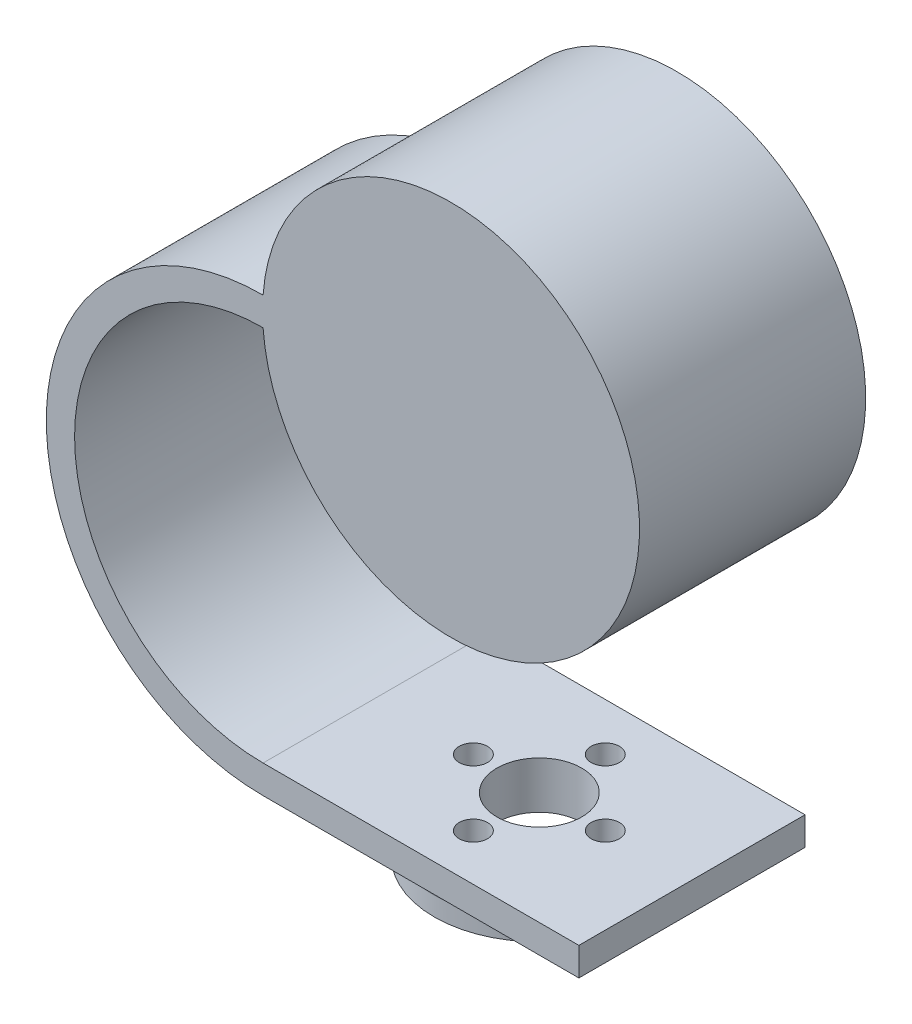
ISO-10303-21;
HEADER;
FILE_DESCRIPTION(('STEP AP214'),'2;1');
FILE_NAME('part.step','',(''),(''),'','','');
FILE_SCHEMA(('AUTOMOTIVE_DESIGN { 1 0 10303 214 1 1 1 1 }'));
ENDSEC;
DATA;
#1=APPLICATION_CONTEXT('core data for automotive mechanical design processes');
#2=APPLICATION_PROTOCOL_DEFINITION('international standard','automotive_design',2000,#1);
#3=PRODUCT_CONTEXT('',#1,'mechanical');
#4=PRODUCT('Part','Part','',(#3));
#5=PRODUCT_RELATED_PRODUCT_CATEGORY('part','',(#4));
#6=PRODUCT_DEFINITION_FORMATION('','',#4);
#7=PRODUCT_DEFINITION_CONTEXT('part definition',#1,'design');
#8=PRODUCT_DEFINITION('design','',#6,#7);
#9=PRODUCT_DEFINITION_SHAPE('','',#8);
#10=(LENGTH_UNIT() NAMED_UNIT(*) SI_UNIT(.MILLI.,.METRE.));
#11=(NAMED_UNIT(*) PLANE_ANGLE_UNIT() SI_UNIT($,.RADIAN.));
#12=(NAMED_UNIT(*) SI_UNIT($,.STERADIAN.) SOLID_ANGLE_UNIT());
#13=UNCERTAINTY_MEASURE_WITH_UNIT(LENGTH_MEASURE(1.E-05),#10,'distance_accuracy_value','');
#14=(GEOMETRIC_REPRESENTATION_CONTEXT(3) GLOBAL_UNCERTAINTY_ASSIGNED_CONTEXT((#13)) GLOBAL_UNIT_ASSIGNED_CONTEXT((#10,
#11,#12)) REPRESENTATION_CONTEXT('',''));
#15=CARTESIAN_POINT('',(0.,0.,0.));
#16=DIRECTION('',(0.,0.,1.));
#17=DIRECTION('',(1.,0.,0.));
#18=AXIS2_PLACEMENT_3D('',#15,#16,#17);
#19=CARTESIAN_POINT('',(30.2631221479555,-52.276236141899,24.));
#20=DIRECTION('',(0.,1.,0.));
#21=DIRECTION('',(0.,0.,1.));
#22=AXIS2_PLACEMENT_3D('',#19,#20,#21);
#23=PLANE('',#22);
#24=CARTESIAN_POINT('',(14.1198779241432,-52.276236141899,12.0544614883675));
#25=DIRECTION('',(0.,1.,0.));
#26=DIRECTION('',(0.,0.,1.));
#27=AXIS2_PLACEMENT_3D('',#24,#25,#26);
#28=CIRCLE('',#27,10.);
#29=CARTESIAN_POINT('',(15.2814853328757,-52.276236141899,21.9867657642129));
#30=VERTEX_POINT('',#29);
#31=CARTESIAN_POINT('',(12.8289573034485,-52.276236141899,2.13813535662565));
#32=VERTEX_POINT('',#31);
#33=EDGE_CURVE('E148',#30,#32,#28,.F.);
#34=ORIENTED_EDGE('',*,*,#33,.F.);
#35=CARTESIAN_POINT('',(13.9905647121855,-52.276236141899,12.0704396324706));
#36=DIRECTION('',(0.,-1.,0.));
#37=DIRECTION('',(0.,0.,-1.));
#38=AXIS2_PLACEMENT_3D('',#35,#36,#37);
#39=CIRCLE('',#38,9.99999999999998);
#40=EDGE_CURVE('E202',#30,#32,#39,.T.);
#41=ORIENTED_EDGE('',*,*,#40,.T.);
#42=EDGE_LOOP('',(#34,#41));
#43=FACE_BOUND('',#42,.T.);
#44=ADVANCED_FACE('F47',(#43),#23,.F.);
#45=CARTESIAN_POINT('',(14.1198779241432,-54.276236141899,12.0544614883675));
#46=DIRECTION('',(0.,-1.,0.));
#47=DIRECTION('',(0.,0.,-1.));
#48=AXIS2_PLACEMENT_3D('',#45,#46,#47);
#49=PLANE('',#48);
#50=CARTESIAN_POINT('',(14.1198779241432,-54.276236141899,12.0544614883675));
#51=DIRECTION('',(0.,-1.,0.));
#52=DIRECTION('',(0.,0.,-1.));
#53=AXIS2_PLACEMENT_3D('',#50,#51,#52);
#54=CIRCLE('',#53,4.5);
#55=CARTESIAN_POINT('',(14.1198779241432,-54.276236141899,7.55446148836747));
#56=VERTEX_POINT('',#55);
#57=EDGE_CURVE('E279',#56,#56,#54,.T.);
#58=ORIENTED_EDGE('',*,*,#57,.F.);
#59=EDGE_LOOP('',(#58));
#60=FACE_BOUND('',#59,.T.);
#61=CARTESIAN_POINT('',(21.1198779241432,-54.276236141899,12.0544614883675));
#62=DIRECTION('',(0.,-1.,0.));
#63=DIRECTION('',(0.,0.,-1.));
#64=AXIS2_PLACEMENT_3D('',#61,#62,#63);
#65=CIRCLE('',#64,1.5);
#66=CARTESIAN_POINT('',(21.1198779241432,-54.276236141899,10.5544614883675));
#67=VERTEX_POINT('',#66);
#68=EDGE_CURVE('E303',#67,#67,#65,.T.);
#69=ORIENTED_EDGE('',*,*,#68,.F.);
#70=EDGE_LOOP('',(#69));
#71=FACE_BOUND('',#70,.T.);
#72=CARTESIAN_POINT('',(14.1198779241432,-54.276236141899,5.05446148836747));
#73=DIRECTION('',(0.,-1.,0.));
#74=DIRECTION('',(0.,0.,-1.));
#75=AXIS2_PLACEMENT_3D('',#72,#73,#74);
#76=CIRCLE('',#75,1.5);
#77=CARTESIAN_POINT('',(14.1198779241432,-54.276236141899,3.55446148836747));
#78=VERTEX_POINT('',#77);
#79=EDGE_CURVE('E280',#78,#78,#76,.T.);
#80=ORIENTED_EDGE('',*,*,#79,.F.);
#81=EDGE_LOOP('',(#80));
#82=FACE_BOUND('',#81,.T.);
#83=CARTESIAN_POINT('',(7.11987792414318,-54.276236141899,12.0544614883675));
#84=DIRECTION('',(0.,-1.,0.));
#85=DIRECTION('',(0.,0.,-1.));
#86=AXIS2_PLACEMENT_3D('',#83,#84,#85);
#87=CIRCLE('',#86,1.5);
#88=CARTESIAN_POINT('',(7.11987792414318,-54.276236141899,10.5544614883675));
#89=VERTEX_POINT('',#88);
#90=EDGE_CURVE('E289',#89,#89,#87,.T.);
#91=ORIENTED_EDGE('',*,*,#90,.F.);
#92=EDGE_LOOP('',(#91));
#93=FACE_BOUND('',#92,.T.);
#94=CARTESIAN_POINT('',(14.1198779241432,-54.276236141899,19.0544614883675));
#95=DIRECTION('',(0.,-1.,0.));
#96=DIRECTION('',(0.,0.,-1.));
#97=AXIS2_PLACEMENT_3D('',#94,#95,#96);
#98=CIRCLE('',#97,1.5);
#99=CARTESIAN_POINT('',(14.1198779241432,-54.276236141899,17.5544614883675));
#100=VERTEX_POINT('',#99);
#101=EDGE_CURVE('E275',#100,#100,#98,.T.);
#102=ORIENTED_EDGE('',*,*,#101,.F.);
#103=EDGE_LOOP('',(#102));
#104=FACE_BOUND('',#103,.T.);
#105=CARTESIAN_POINT('',(13.9905647121855,-54.276236141899,12.0704396324706));
#106=DIRECTION('',(0.,-1.,0.));
#107=DIRECTION('',(0.,0.,-1.));
#108=AXIS2_PLACEMENT_3D('',#105,#106,#107);
#109=CIRCLE('',#108,9.99999999999998);
#110=CARTESIAN_POINT('',(15.2814853328757,-54.276236141899,21.9867657642129));
#111=VERTEX_POINT('',#110);
#112=CARTESIAN_POINT('',(12.8289573034485,-54.276236141899,2.13813535662566));
#113=VERTEX_POINT('',#112);
#114=EDGE_CURVE('E136',#111,#113,#109,.F.);
#115=ORIENTED_EDGE('',*,*,#114,.F.);
#116=CARTESIAN_POINT('',(14.1198779241432,-54.276236141899,12.0544614883675));
#117=DIRECTION('',(0.,-1.,0.));
#118=DIRECTION('',(0.,0.,-1.));
#119=AXIS2_PLACEMENT_3D('',#116,#117,#118);
#120=CIRCLE('',#119,10.);
#121=EDGE_CURVE('E132',#111,#113,#120,.T.);
#122=ORIENTED_EDGE('',*,*,#121,.T.);
#123=EDGE_LOOP('',(#115,#122));
#124=FACE_BOUND('',#123,.T.);
#125=ADVANCED_FACE('F134',(#60,#71,#82,#93,#104,#124),#49,.T.);
#126=DIRECTION('',(1.,0.,0.));
#127=VECTOR('',#126,1.);
#128=CARTESIAN_POINT('',(30.2631221479555,-52.276236141899,24.));
#129=LINE('',#128,#127);
#130=CARTESIAN_POINT('',(15.2888672337385,-52.276236141899,24.));
#131=VERTEX_POINT('',#130);
#132=CARTESIAN_POINT('',(30.2631221479555,-52.276236141899,24.));
#133=VERTEX_POINT('',#132);
#134=EDGE_CURVE('E314',#131,#133,#129,.T.);
#135=ORIENTED_EDGE('',*,*,#134,.F.);
#136=CARTESIAN_POINT('',(13.9905647121855,-52.276236141899,12.0704396324706));
#137=DIRECTION('',(0.,1.,0.));
#138=DIRECTION('',(0.,0.,1.));
#139=AXIS2_PLACEMENT_3D('',#136,#137,#138);
#140=CIRCLE('',#139,12.);
#141=CARTESIAN_POINT('',(12.6922621906326,-52.276236141899,24.));
#142=VERTEX_POINT('',#141);
#143=EDGE_CURVE('E11',#131,#142,#140,.T.);
#144=ORIENTED_EDGE('',*,*,#143,.T.);
#145=CARTESIAN_POINT('',(-3.24733384677033,-52.276236141899,24.));
#146=VERTEX_POINT('',#145);
#147=EDGE_CURVE('E310',#146,#142,#129,.T.);
#148=ORIENTED_EDGE('',*,*,#147,.F.);
#149=DIRECTION('',(0.,0.,-1.));
#150=VECTOR('',#149,1.);
#151=CARTESIAN_POINT('',(-3.24733384677033,-52.276236141899,24.));
#152=LINE('',#151,#150);
#153=CARTESIAN_POINT('',(-3.24733384677033,-52.276236141899,0.));
#154=VERTEX_POINT('',#153);
#155=EDGE_CURVE('E329',#146,#154,#152,.T.);
#156=ORIENTED_EDGE('',*,*,#155,.T.);
#157=DIRECTION('',(1.,0.,0.));
#158=VECTOR('',#157,1.);
#159=CARTESIAN_POINT('',(30.2631221479555,-52.276236141899,0.));
#160=LINE('',#159,#158);
#161=CARTESIAN_POINT('',(30.2631221479555,-52.276236141899,0.));
#162=VERTEX_POINT('',#161);
#163=EDGE_CURVE('E140',#154,#162,#160,.T.);
#164=ORIENTED_EDGE('',*,*,#163,.T.);
#165=DIRECTION('',(0.,0.,-1.));
#166=VECTOR('',#165,1.);
#167=CARTESIAN_POINT('',(30.2631221479555,-52.276236141899,24.));
#168=LINE('',#167,#166);
#169=EDGE_CURVE('E367',#133,#162,#168,.T.);
#170=ORIENTED_EDGE('',*,*,#169,.F.);
#171=EDGE_LOOP('',(#135,#144,#148,#156,#164,#170));
#172=FACE_BOUND('',#171,.T.);
#173=ADVANCED_FACE('F192',(#172),#23,.F.);
#174=CARTESIAN_POINT('',(30.2631221479555,-52.276236141899,24.));
#175=DIRECTION('',(-1.,0.,0.));
#176=DIRECTION('',(0.,0.,1.));
#177=AXIS2_PLACEMENT_3D('',#174,#175,#176);
#178=PLANE('',#177);
#179=DIRECTION('',(0.,1.,0.));
#180=VECTOR('',#179,1.);
#181=CARTESIAN_POINT('',(30.2631221479555,-52.276236141899,0.));
#182=LINE('',#181,#180);
#183=CARTESIAN_POINT('',(30.2631221479555,-49.276236141899,0.));
#184=VERTEX_POINT('',#183);
#185=EDGE_CURVE('E333',#162,#184,#182,.T.);
#186=ORIENTED_EDGE('',*,*,#185,.T.);
#187=DIRECTION('',(0.,0.,-1.));
#188=VECTOR('',#187,1.);
#189=CARTESIAN_POINT('',(30.2631221479555,-49.276236141899,24.));
#190=LINE('',#189,#188);
#191=CARTESIAN_POINT('',(30.2631221479555,-49.276236141899,24.));
#192=VERTEX_POINT('',#191);
#193=EDGE_CURVE('E363',#192,#184,#190,.T.);
#194=ORIENTED_EDGE('',*,*,#193,.F.);
#195=DIRECTION('',(0.,1.,0.));
#196=VECTOR('',#195,1.);
#197=CARTESIAN_POINT('',(30.2631221479555,-52.276236141899,24.));
#198=LINE('',#197,#196);
#199=EDGE_CURVE('E313',#133,#192,#198,.T.);
#200=ORIENTED_EDGE('',*,*,#199,.F.);
#201=ORIENTED_EDGE('',*,*,#169,.T.);
#202=EDGE_LOOP('',(#186,#194,#200,#201));
#203=FACE_BOUND('',#202,.T.);
#204=ADVANCED_FACE('F378',(#203),#178,.F.);
#205=CARTESIAN_POINT('',(30.2631221479555,-49.276236141899,24.));
#206=DIRECTION('',(0.,-1.,0.));
#207=DIRECTION('',(1.,0.,0.));
#208=AXIS2_PLACEMENT_3D('',#205,#206,#207);
#209=PLANE('',#208);
#210=CARTESIAN_POINT('',(14.1198779241432,-49.276236141899,19.0544614883675));
#211=DIRECTION('',(0.,-1.,0.));
#212=DIRECTION('',(0.,0.,-1.));
#213=AXIS2_PLACEMENT_3D('',#210,#211,#212);
#214=CIRCLE('',#213,1.5);
#215=CARTESIAN_POINT('',(14.1198779241432,-49.276236141899,17.5544614883675));
#216=VERTEX_POINT('',#215);
#217=EDGE_CURVE('E141',#216,#216,#214,.T.);
#218=ORIENTED_EDGE('',*,*,#217,.T.);
#219=EDGE_LOOP('',(#218));
#220=FACE_BOUND('',#219,.T.);
#221=CARTESIAN_POINT('',(7.11987792414318,-49.276236141899,12.0544614883675));
#222=DIRECTION('',(0.,-1.,0.));
#223=DIRECTION('',(0.,0.,-1.));
#224=AXIS2_PLACEMENT_3D('',#221,#222,#223);
#225=CIRCLE('',#224,1.5);
#226=CARTESIAN_POINT('',(7.11987792414318,-49.276236141899,10.5544614883675));
#227=VERTEX_POINT('',#226);
#228=EDGE_CURVE('E271',#227,#227,#225,.T.);
#229=ORIENTED_EDGE('',*,*,#228,.T.);
#230=EDGE_LOOP('',(#229));
#231=FACE_BOUND('',#230,.T.);
#232=CARTESIAN_POINT('',(14.1198779241432,-49.276236141899,5.05446148836747));
#233=DIRECTION('',(0.,-1.,0.));
#234=DIRECTION('',(0.,0.,-1.));
#235=AXIS2_PLACEMENT_3D('',#232,#233,#234);
#236=CIRCLE('',#235,1.5);
#237=CARTESIAN_POINT('',(14.1198779241432,-49.276236141899,3.55446148836747));
#238=VERTEX_POINT('',#237);
#239=EDGE_CURVE('E285',#238,#238,#236,.T.);
#240=ORIENTED_EDGE('',*,*,#239,.T.);
#241=EDGE_LOOP('',(#240));
#242=FACE_BOUND('',#241,.T.);
#243=CARTESIAN_POINT('',(21.1198779241432,-49.276236141899,12.0544614883675));
#244=DIRECTION('',(0.,-1.,0.));
#245=DIRECTION('',(0.,0.,-1.));
#246=AXIS2_PLACEMENT_3D('',#243,#244,#245);
#247=CIRCLE('',#246,1.5);
#248=CARTESIAN_POINT('',(21.1198779241432,-49.276236141899,10.5544614883675));
#249=VERTEX_POINT('',#248);
#250=EDGE_CURVE('E284',#249,#249,#247,.T.);
#251=ORIENTED_EDGE('',*,*,#250,.T.);
#252=EDGE_LOOP('',(#251));
#253=FACE_BOUND('',#252,.T.);
#254=CARTESIAN_POINT('',(14.1198779241432,-49.276236141899,12.0544614883675));
#255=DIRECTION('',(0.,-1.,0.));
#256=DIRECTION('',(0.,0.,-1.));
#257=AXIS2_PLACEMENT_3D('',#254,#255,#256);
#258=CIRCLE('',#257,4.5);
#259=CARTESIAN_POINT('',(14.1198779241432,-49.276236141899,7.55446148836747));
#260=VERTEX_POINT('',#259);
#261=EDGE_CURVE('E299',#260,#260,#258,.T.);
#262=ORIENTED_EDGE('',*,*,#261,.T.);
#263=EDGE_LOOP('',(#262));
#264=FACE_BOUND('',#263,.T.);
#265=DIRECTION('',(-1.,0.,0.));
#266=VECTOR('',#265,1.);
#267=CARTESIAN_POINT('',(30.2631221479555,-49.276236141899,0.));
#268=LINE('',#267,#266);
#269=CARTESIAN_POINT('',(-3.24733384677034,-49.276236141899,0.));
#270=VERTEX_POINT('',#269);
#271=EDGE_CURVE('E336',#184,#270,#268,.T.);
#272=ORIENTED_EDGE('',*,*,#271,.T.);
#273=DIRECTION('',(0.,0.,-1.));
#274=VECTOR('',#273,1.);
#275=CARTESIAN_POINT('',(-3.24733384677034,-49.276236141899,24.));
#276=LINE('',#275,#274);
#277=CARTESIAN_POINT('',(-3.24733384677034,-49.276236141899,24.));
#278=VERTEX_POINT('',#277);
#279=EDGE_CURVE('E359',#278,#270,#276,.T.);
#280=ORIENTED_EDGE('',*,*,#279,.F.);
#281=DIRECTION('',(-1.,0.,0.));
#282=VECTOR('',#281,1.);
#283=CARTESIAN_POINT('',(30.2631221479555,-49.276236141899,24.));
#284=LINE('',#283,#282);
#285=EDGE_CURVE('E317',#192,#278,#284,.T.);
#286=ORIENTED_EDGE('',*,*,#285,.F.);
#287=ORIENTED_EDGE('',*,*,#193,.T.);
#288=EDGE_LOOP('',(#272,#280,#286,#287));
#289=FACE_BOUND('',#288,.T.);
#290=ADVANCED_FACE('F389',(#220,#231,#242,#253,#264,#289),#209,.F.);
#291=CARTESIAN_POINT('',(-3.24733384677034,-29.276236141899,24.));
#292=DIRECTION('',(0.,0.,-1.));
#293=DIRECTION('',(-1.,0.,0.));
#294=AXIS2_PLACEMENT_3D('',#291,#292,#293);
#295=CYLINDRICAL_SURFACE('',#294,20.);
#296=CARTESIAN_POINT('',(-3.24733384677034,-29.276236141899,0.));
#297=DIRECTION('',(0.,0.,-1.));
#298=DIRECTION('',(-1.,0.,0.));
#299=AXIS2_PLACEMENT_3D('',#296,#297,#298);
#300=CIRCLE('',#299,20.);
#301=CARTESIAN_POINT('',(-3.24733384677034,-9.27623614189904,0.));
#302=VERTEX_POINT('',#301);
#303=EDGE_CURVE('E339',#270,#302,#300,.T.);
#304=ORIENTED_EDGE('',*,*,#303,.T.);
#305=DIRECTION('',(0.,0.,-1.));
#306=VECTOR('',#305,1.);
#307=CARTESIAN_POINT('',(-3.24733384677034,-9.27623614189904,24.));
#308=LINE('',#307,#306);
#309=CARTESIAN_POINT('',(-3.24733384677034,-9.27623614189904,24.));
#310=VERTEX_POINT('',#309);
#311=EDGE_CURVE('E355',#310,#302,#308,.T.);
#312=ORIENTED_EDGE('',*,*,#311,.F.);
#313=CARTESIAN_POINT('',(-3.24733384677034,-29.276236141899,24.));
#314=DIRECTION('',(0.,0.,-1.));
#315=DIRECTION('',(-1.,0.,0.));
#316=AXIS2_PLACEMENT_3D('',#313,#314,#315);
#317=CIRCLE('',#316,20.);
#318=EDGE_CURVE('E320',#278,#310,#317,.T.);
#319=ORIENTED_EDGE('',*,*,#318,.F.);
#320=ORIENTED_EDGE('',*,*,#279,.T.);
#321=EDGE_LOOP('',(#304,#312,#319,#320));
#322=FACE_BOUND('',#321,.T.);
#323=ADVANCED_FACE('F396',(#322),#295,.F.);
#324=CARTESIAN_POINT('',(16.6963368284088,-7.77623614189905,24.));
#325=DIRECTION('',(0.,0.,-1.));
#326=DIRECTION('',(-1.,0.,0.));
#327=AXIS2_PLACEMENT_3D('',#324,#325,#326);
#328=CYLINDRICAL_SURFACE('',#327,20.);
#329=CARTESIAN_POINT('',(16.6963368284088,-7.77623614189905,0.));
#330=DIRECTION('',(0.,0.,1.));
#331=DIRECTION('',(1.,0.,0.));
#332=AXIS2_PLACEMENT_3D('',#329,#330,#331);
#333=CIRCLE('',#332,20.);
#334=CARTESIAN_POINT('',(-3.24733384677034,-6.27623614189907,0.));
#335=VERTEX_POINT('',#334);
#336=EDGE_CURVE('E342',#302,#335,#333,.T.);
#337=ORIENTED_EDGE('',*,*,#336,.T.);
#338=DIRECTION('',(0.,0.,-1.));
#339=VECTOR('',#338,1.);
#340=CARTESIAN_POINT('',(-3.24733384677034,-6.27623614189907,24.));
#341=LINE('',#340,#339);
#342=CARTESIAN_POINT('',(-3.24733384677034,-6.27623614189907,24.));
#343=VERTEX_POINT('',#342);
#344=EDGE_CURVE('E351',#343,#335,#341,.T.);
#345=ORIENTED_EDGE('',*,*,#344,.F.);
#346=CARTESIAN_POINT('',(16.6963368284088,-7.77623614189905,24.));
#347=DIRECTION('',(0.,0.,1.));
#348=DIRECTION('',(1.,0.,0.));
#349=AXIS2_PLACEMENT_3D('',#346,#347,#348);
#350=CIRCLE('',#349,20.);
#351=EDGE_CURVE('E323',#310,#343,#350,.T.);
#352=ORIENTED_EDGE('',*,*,#351,.F.);
#353=ORIENTED_EDGE('',*,*,#311,.T.);
#354=EDGE_LOOP('',(#337,#345,#352,#353));
#355=FACE_BOUND('',#354,.T.);
#356=ADVANCED_FACE('F398',(#355),#328,.T.);
#357=CARTESIAN_POINT('',(-3.24733384677034,-29.276236141899,24.));
#358=DIRECTION('',(0.,0.,-1.));
#359=DIRECTION('',(-1.,0.,0.));
#360=AXIS2_PLACEMENT_3D('',#357,#358,#359);
#361=CYLINDRICAL_SURFACE('',#360,23.);
#362=CARTESIAN_POINT('',(-3.24733384677034,-29.276236141899,0.));
#363=DIRECTION('',(0.,0.,1.));
#364=DIRECTION('',(-1.,0.,0.));
#365=AXIS2_PLACEMENT_3D('',#362,#363,#364);
#366=CIRCLE('',#365,23.);
#367=EDGE_CURVE('E345',#335,#154,#366,.T.);
#368=ORIENTED_EDGE('',*,*,#367,.T.);
#369=ORIENTED_EDGE('',*,*,#155,.F.);
#370=CARTESIAN_POINT('',(-3.24733384677034,-29.276236141899,24.));
#371=DIRECTION('',(0.,0.,1.));
#372=DIRECTION('',(-1.,0.,0.));
#373=AXIS2_PLACEMENT_3D('',#370,#371,#372);
#374=CIRCLE('',#373,23.);
#375=EDGE_CURVE('E326',#343,#146,#374,.T.);
#376=ORIENTED_EDGE('',*,*,#375,.F.);
#377=ORIENTED_EDGE('',*,*,#344,.T.);
#378=EDGE_LOOP('',(#368,#369,#376,#377));
#379=FACE_BOUND('',#378,.T.);
#380=ADVANCED_FACE('F401',(#379),#361,.T.);
#381=CARTESIAN_POINT('',(-3.24733384677034,-29.276236141899,24.));
#382=DIRECTION('',(0.,0.,-1.));
#383=DIRECTION('',(-1.,0.,0.));
#384=AXIS2_PLACEMENT_3D('',#381,#382,#383);
#385=PLANE('',#384);
#386=ORIENTED_EDGE('',*,*,#147,.T.);
#387=EDGE_CURVE('E208',#142,#131,#129,.T.);
#388=ORIENTED_EDGE('',*,*,#387,.T.);
#389=ORIENTED_EDGE('',*,*,#134,.T.);
#390=ORIENTED_EDGE('',*,*,#199,.T.);
#391=ORIENTED_EDGE('',*,*,#285,.T.);
#392=ORIENTED_EDGE('',*,*,#318,.T.);
#393=ORIENTED_EDGE('',*,*,#351,.T.);
#394=ORIENTED_EDGE('',*,*,#375,.T.);
#395=EDGE_LOOP('',(#386,#388,#389,#390,#391,#392,#393,#394));
#396=FACE_BOUND('',#395,.T.);
#397=ADVANCED_FACE('F195',(#396),#385,.F.);
#398=CARTESIAN_POINT('',(-3.24733384677034,-29.276236141899,0.));
#399=DIRECTION('',(0.,0.,-1.));
#400=DIRECTION('',(-1.,0.,0.));
#401=AXIS2_PLACEMENT_3D('',#398,#399,#400);
#402=PLANE('',#401);
#403=CARTESIAN_POINT('',(17.2217108120383,-7.59831274438809,0.));
#404=DIRECTION('',(0.,0.,-1.));
#405=DIRECTION('',(-1.,0.,0.));
#406=AXIS2_PLACEMENT_3D('',#403,#404,#405);
#407=CIRCLE('',#406,11.);
#408=CARTESIAN_POINT('',(6.22171081203829,-7.59831274438809,0.));
#409=VERTEX_POINT('',#408);
#410=EDGE_CURVE('E158',#409,#409,#407,.F.);
#411=ORIENTED_EDGE('',*,*,#410,.T.);
#412=EDGE_LOOP('',(#411));
#413=FACE_BOUND('',#412,.T.);
#414=ORIENTED_EDGE('',*,*,#163,.F.);
#415=ORIENTED_EDGE('',*,*,#367,.F.);
#416=ORIENTED_EDGE('',*,*,#336,.F.);
#417=ORIENTED_EDGE('',*,*,#303,.F.);
#418=ORIENTED_EDGE('',*,*,#271,.F.);
#419=ORIENTED_EDGE('',*,*,#185,.F.);
#420=EDGE_LOOP('',(#414,#415,#416,#417,#418,#419));
#421=FACE_BOUND('',#420,.T.);
#422=ADVANCED_FACE('F384',(#413,#421),#402,.T.);
#423=CARTESIAN_POINT('',(14.1198779241432,-54.276236141899,12.0544614883675));
#424=DIRECTION('',(0.,1.,0.));
#425=DIRECTION('',(0.,0.,1.));
#426=AXIS2_PLACEMENT_3D('',#423,#424,#425);
#427=CYLINDRICAL_SURFACE('',#426,10.);
#428=ORIENTED_EDGE('',*,*,#121,.F.);
#429=DIRECTION('',(0.,1.,0.));
#430=VECTOR('',#429,1.);
#431=CARTESIAN_POINT('',(15.2814853328757,-53.776236141899,21.9867657642129));
#432=LINE('',#431,#430);
#433=EDGE_CURVE('E152',#111,#30,#432,.T.);
#434=ORIENTED_EDGE('',*,*,#433,.T.);
#435=ORIENTED_EDGE('',*,*,#33,.T.);
#436=DIRECTION('',(0.,1.,0.));
#437=VECTOR('',#436,1.);
#438=CARTESIAN_POINT('',(12.8289573034485,-53.776236141899,2.13813535662566));
#439=LINE('',#438,#437);
#440=EDGE_CURVE('E145',#32,#113,#439,.F.);
#441=ORIENTED_EDGE('',*,*,#440,.T.);
#442=EDGE_LOOP('',(#428,#434,#435,#441));
#443=FACE_BOUND('',#442,.T.);
#444=ADVANCED_FACE('F146',(#443),#427,.T.);
#445=CARTESIAN_POINT('',(14.1198779241432,-49.276236141899,12.0544614883675));
#446=DIRECTION('',(0.,-1.,0.));
#447=DIRECTION('',(0.,0.,-1.));
#448=AXIS2_PLACEMENT_3D('',#445,#446,#447);
#449=CYLINDRICAL_SURFACE('',#448,4.5);
#450=ORIENTED_EDGE('',*,*,#261,.F.);
#451=EDGE_LOOP('',(#450));
#452=FACE_BOUND('',#451,.T.);
#453=ORIENTED_EDGE('',*,*,#57,.T.);
#454=EDGE_LOOP('',(#453));
#455=FACE_BOUND('',#454,.T.);
#456=ADVANCED_FACE('F467',(#452,#455),#449,.F.);
#457=CARTESIAN_POINT('',(21.1198779241432,-49.276236141899,12.0544614883675));
#458=DIRECTION('',(0.,-1.,0.));
#459=DIRECTION('',(0.,0.,-1.));
#460=AXIS2_PLACEMENT_3D('',#457,#458,#459);
#461=CYLINDRICAL_SURFACE('',#460,1.5);
#462=ORIENTED_EDGE('',*,*,#250,.F.);
#463=EDGE_LOOP('',(#462));
#464=FACE_BOUND('',#463,.T.);
#465=ORIENTED_EDGE('',*,*,#68,.T.);
#466=EDGE_LOOP('',(#465));
#467=FACE_BOUND('',#466,.T.);
#468=ADVANCED_FACE('F476',(#464,#467),#461,.F.);
#469=CARTESIAN_POINT('',(14.1198779241432,-49.276236141899,5.05446148836747));
#470=DIRECTION('',(0.,-1.,0.));
#471=DIRECTION('',(0.,0.,-1.));
#472=AXIS2_PLACEMENT_3D('',#469,#470,#471);
#473=CYLINDRICAL_SURFACE('',#472,1.5);
#474=ORIENTED_EDGE('',*,*,#239,.F.);
#475=EDGE_LOOP('',(#474));
#476=FACE_BOUND('',#475,.T.);
#477=ORIENTED_EDGE('',*,*,#79,.T.);
#478=EDGE_LOOP('',(#477));
#479=FACE_BOUND('',#478,.T.);
#480=ADVANCED_FACE('F486',(#476,#479),#473,.F.);
#481=CARTESIAN_POINT('',(7.11987792414318,-49.276236141899,12.0544614883675));
#482=DIRECTION('',(0.,-1.,0.));
#483=DIRECTION('',(0.,0.,-1.));
#484=AXIS2_PLACEMENT_3D('',#481,#482,#483);
#485=CYLINDRICAL_SURFACE('',#484,1.5);
#486=ORIENTED_EDGE('',*,*,#228,.F.);
#487=EDGE_LOOP('',(#486));
#488=FACE_BOUND('',#487,.T.);
#489=ORIENTED_EDGE('',*,*,#90,.T.);
#490=EDGE_LOOP('',(#489));
#491=FACE_BOUND('',#490,.T.);
#492=ADVANCED_FACE('F496',(#488,#491),#485,.F.);
#493=CARTESIAN_POINT('',(14.1198779241432,-49.276236141899,19.0544614883675));
#494=DIRECTION('',(0.,-1.,0.));
#495=DIRECTION('',(0.,0.,-1.));
#496=AXIS2_PLACEMENT_3D('',#493,#494,#495);
#497=CYLINDRICAL_SURFACE('',#496,1.5);
#498=ORIENTED_EDGE('',*,*,#217,.F.);
#499=EDGE_LOOP('',(#498));
#500=FACE_BOUND('',#499,.T.);
#501=ORIENTED_EDGE('',*,*,#101,.T.);
#502=EDGE_LOOP('',(#501));
#503=FACE_BOUND('',#502,.T.);
#504=ADVANCED_FACE('F506',(#500,#503),#497,.F.);
#505=CARTESIAN_POINT('',(17.2217108120383,-7.59831274438809,-1.));
#506=DIRECTION('',(0.,0.,-1.));
#507=DIRECTION('',(-1.,0.,0.));
#508=AXIS2_PLACEMENT_3D('',#505,#506,#507);
#509=PLANE('',#508);
#510=CARTESIAN_POINT('',(17.2217108120383,-0.59831274438809,-1.));
#511=DIRECTION('',(0.,0.,-1.));
#512=DIRECTION('',(-1.,0.,0.));
#513=AXIS2_PLACEMENT_3D('',#510,#511,#512);
#514=CIRCLE('',#513,1.5);
#515=CARTESIAN_POINT('',(15.7217108120383,-0.59831274438809,-1.));
#516=VERTEX_POINT('',#515);
#517=EDGE_CURVE('E233',#516,#516,#514,.T.);
#518=ORIENTED_EDGE('',*,*,#517,.F.);
#519=EDGE_LOOP('',(#518));
#520=FACE_BOUND('',#519,.T.);
#521=CARTESIAN_POINT('',(24.2217108120381,-7.59831274438826,-1.));
#522=DIRECTION('',(0.,0.,-1.));
#523=DIRECTION('',(-1.,0.,0.));
#524=AXIS2_PLACEMENT_3D('',#521,#522,#523);
#525=CIRCLE('',#524,1.5);
#526=CARTESIAN_POINT('',(22.7217108120381,-7.59831274438826,-1.));
#527=VERTEX_POINT('',#526);
#528=EDGE_CURVE('E247',#527,#527,#525,.T.);
#529=ORIENTED_EDGE('',*,*,#528,.F.);
#530=EDGE_LOOP('',(#529));
#531=FACE_BOUND('',#530,.T.);
#532=CARTESIAN_POINT('',(17.221710812038,-14.5983127443881,-1.));
#533=DIRECTION('',(0.,0.,-1.));
#534=DIRECTION('',(-1.,0.,0.));
#535=AXIS2_PLACEMENT_3D('',#532,#533,#534);
#536=CIRCLE('',#535,1.5);
#537=CARTESIAN_POINT('',(15.721710812038,-14.5983127443881,-1.));
#538=VERTEX_POINT('',#537);
#539=EDGE_CURVE('E238',#538,#538,#536,.T.);
#540=ORIENTED_EDGE('',*,*,#539,.F.);
#541=EDGE_LOOP('',(#540));
#542=FACE_BOUND('',#541,.T.);
#543=CARTESIAN_POINT('',(10.2217108120381,-7.59831274438792,-1.));
#544=DIRECTION('',(0.,0.,-1.));
#545=DIRECTION('',(-1.,0.,0.));
#546=AXIS2_PLACEMENT_3D('',#543,#544,#545);
#547=CIRCLE('',#546,1.5);
#548=CARTESIAN_POINT('',(8.72171081203813,-7.59831274438792,-1.));
#549=VERTEX_POINT('',#548);
#550=EDGE_CURVE('E261',#549,#549,#547,.T.);
#551=ORIENTED_EDGE('',*,*,#550,.F.);
#552=EDGE_LOOP('',(#551));
#553=FACE_BOUND('',#552,.T.);
#554=CARTESIAN_POINT('',(17.2217108120383,-7.59831274438809,-1.));
#555=DIRECTION('',(0.,0.,-1.));
#556=DIRECTION('',(-1.,0.,0.));
#557=AXIS2_PLACEMENT_3D('',#554,#555,#556);
#558=CIRCLE('',#557,4.5);
#559=CARTESIAN_POINT('',(12.7217108120383,-7.59831274438809,-1.));
#560=VERTEX_POINT('',#559);
#561=EDGE_CURVE('E237',#560,#560,#558,.T.);
#562=ORIENTED_EDGE('',*,*,#561,.F.);
#563=EDGE_LOOP('',(#562));
#564=FACE_BOUND('',#563,.T.);
#565=CARTESIAN_POINT('',(17.2217108120383,-7.59831274438809,-1.));
#566=DIRECTION('',(0.,0.,-1.));
#567=DIRECTION('',(-1.,0.,0.));
#568=AXIS2_PLACEMENT_3D('',#565,#566,#567);
#569=CIRCLE('',#568,10.);
#570=CARTESIAN_POINT('',(7.22171081203829,-7.59831274438809,-1.));
#571=VERTEX_POINT('',#570);
#572=EDGE_CURVE('E232',#571,#571,#569,.T.);
#573=ORIENTED_EDGE('',*,*,#572,.T.);
#574=EDGE_LOOP('',(#573));
#575=FACE_BOUND('',#574,.T.);
#576=ADVANCED_FACE('F515',(#520,#531,#542,#553,#564,#575),#509,.T.);
#577=CARTESIAN_POINT('',(17.2217108120383,-7.59831274438809,-1.));
#578=DIRECTION('',(0.,0.,-1.));
#579=DIRECTION('',(-1.,0.,0.));
#580=AXIS2_PLACEMENT_3D('',#577,#578,#579);
#581=TOROIDAL_SURFACE('',#580,11.,1.);
#582=ORIENTED_EDGE('',*,*,#410,.F.);
#583=EDGE_LOOP('',(#582));
#584=FACE_BOUND('',#583,.T.);
#585=ORIENTED_EDGE('',*,*,#572,.F.);
#586=EDGE_LOOP('',(#585));
#587=FACE_BOUND('',#586,.T.);
#588=ADVANCED_FACE('F183',(#584,#587),#581,.F.);
#589=CARTESIAN_POINT('',(17.2217108120383,-7.59831274438809,9.));
#590=DIRECTION('',(0.,0.,-1.));
#591=DIRECTION('',(-1.,0.,0.));
#592=AXIS2_PLACEMENT_3D('',#589,#590,#591);
#593=CYLINDRICAL_SURFACE('',#592,4.5);
#594=CARTESIAN_POINT('',(17.2217108120383,-7.59831274438809,9.));
#595=DIRECTION('',(0.,0.,-1.));
#596=DIRECTION('',(-1.,0.,0.));
#597=AXIS2_PLACEMENT_3D('',#594,#595,#596);
#598=CIRCLE('',#597,4.5);
#599=CARTESIAN_POINT('',(12.7217108120383,-7.59831274438809,9.));
#600=VERTEX_POINT('',#599);
#601=EDGE_CURVE('E257',#600,#600,#598,.T.);
#602=ORIENTED_EDGE('',*,*,#601,.F.);
#603=EDGE_LOOP('',(#602));
#604=FACE_BOUND('',#603,.T.);
#605=ORIENTED_EDGE('',*,*,#561,.T.);
#606=EDGE_LOOP('',(#605));
#607=FACE_BOUND('',#606,.T.);
#608=ADVANCED_FACE('F534',(#604,#607),#593,.F.);
#609=CARTESIAN_POINT('',(17.2217108120383,-7.59831274438809,9.));
#610=DIRECTION('',(0.,0.,-1.));
#611=DIRECTION('',(-1.,0.,0.));
#612=AXIS2_PLACEMENT_3D('',#609,#610,#611);
#613=PLANE('',#612);
#614=ORIENTED_EDGE('',*,*,#601,.T.);
#615=EDGE_LOOP('',(#614));
#616=FACE_BOUND('',#615,.T.);
#617=ADVANCED_FACE('F542',(#616),#613,.T.);
#618=CARTESIAN_POINT('',(10.2217108120381,-7.59831274438792,9.));
#619=DIRECTION('',(0.,0.,-1.));
#620=DIRECTION('',(-1.,0.,0.));
#621=AXIS2_PLACEMENT_3D('',#618,#619,#620);
#622=CYLINDRICAL_SURFACE('',#621,1.5);
#623=CARTESIAN_POINT('',(10.2217108120381,-7.59831274438792,9.));
#624=DIRECTION('',(0.,0.,-1.));
#625=DIRECTION('',(-1.,0.,0.));
#626=AXIS2_PLACEMENT_3D('',#623,#624,#625);
#627=CIRCLE('',#626,1.5);
#628=CARTESIAN_POINT('',(8.72171081203813,-7.59831274438792,9.));
#629=VERTEX_POINT('',#628);
#630=EDGE_CURVE('E242',#629,#629,#627,.T.);
#631=ORIENTED_EDGE('',*,*,#630,.F.);
#632=EDGE_LOOP('',(#631));
#633=FACE_BOUND('',#632,.T.);
#634=ORIENTED_EDGE('',*,*,#550,.T.);
#635=EDGE_LOOP('',(#634));
#636=FACE_BOUND('',#635,.T.);
#637=ADVANCED_FACE('F552',(#633,#636),#622,.F.);
#638=CARTESIAN_POINT('',(10.2217108120381,-7.59831274438792,9.));
#639=DIRECTION('',(0.,0.,-1.));
#640=DIRECTION('',(-1.,0.,0.));
#641=AXIS2_PLACEMENT_3D('',#638,#639,#640);
#642=PLANE('',#641);
#643=ORIENTED_EDGE('',*,*,#630,.T.);
#644=EDGE_LOOP('',(#643));
#645=FACE_BOUND('',#644,.T.);
#646=ADVANCED_FACE('F562',(#645),#642,.T.);
#647=CARTESIAN_POINT('',(17.221710812038,-14.5983127443881,9.));
#648=DIRECTION('',(0.,0.,-1.));
#649=DIRECTION('',(-1.,0.,0.));
#650=AXIS2_PLACEMENT_3D('',#647,#648,#649);
#651=CYLINDRICAL_SURFACE('',#650,1.5);
#652=CARTESIAN_POINT('',(17.221710812038,-14.5983127443881,9.));
#653=DIRECTION('',(0.,0.,-1.));
#654=DIRECTION('',(-1.,0.,0.));
#655=AXIS2_PLACEMENT_3D('',#652,#653,#654);
#656=CIRCLE('',#655,1.5);
#657=CARTESIAN_POINT('',(15.721710812038,-14.5983127443881,9.));
#658=VERTEX_POINT('',#657);
#659=EDGE_CURVE('E243',#658,#658,#656,.T.);
#660=ORIENTED_EDGE('',*,*,#659,.F.);
#661=EDGE_LOOP('',(#660));
#662=FACE_BOUND('',#661,.T.);
#663=ORIENTED_EDGE('',*,*,#539,.T.);
#664=EDGE_LOOP('',(#663));
#665=FACE_BOUND('',#664,.T.);
#666=ADVANCED_FACE('F572',(#662,#665),#651,.F.);
#667=CARTESIAN_POINT('',(17.221710812038,-14.5983127443881,9.));
#668=DIRECTION('',(0.,0.,-1.));
#669=DIRECTION('',(-1.,0.,0.));
#670=AXIS2_PLACEMENT_3D('',#667,#668,#669);
#671=PLANE('',#670);
#672=ORIENTED_EDGE('',*,*,#659,.T.);
#673=EDGE_LOOP('',(#672));
#674=FACE_BOUND('',#673,.T.);
#675=ADVANCED_FACE('F582',(#674),#671,.T.);
#676=CARTESIAN_POINT('',(24.2217108120381,-7.59831274438826,9.));
#677=DIRECTION('',(0.,0.,-1.));
#678=DIRECTION('',(-1.,0.,0.));
#679=AXIS2_PLACEMENT_3D('',#676,#677,#678);
#680=CYLINDRICAL_SURFACE('',#679,1.5);
#681=CARTESIAN_POINT('',(24.2217108120381,-7.59831274438826,9.));
#682=DIRECTION('',(0.,0.,-1.));
#683=DIRECTION('',(-1.,0.,0.));
#684=AXIS2_PLACEMENT_3D('',#681,#682,#683);
#685=CIRCLE('',#684,1.5);
#686=CARTESIAN_POINT('',(22.7217108120381,-7.59831274438826,9.));
#687=VERTEX_POINT('',#686);
#688=EDGE_CURVE('E227',#687,#687,#685,.T.);
#689=ORIENTED_EDGE('',*,*,#688,.F.);
#690=EDGE_LOOP('',(#689));
#691=FACE_BOUND('',#690,.T.);
#692=ORIENTED_EDGE('',*,*,#528,.T.);
#693=EDGE_LOOP('',(#692));
#694=FACE_BOUND('',#693,.T.);
#695=ADVANCED_FACE('F592',(#691,#694),#680,.F.);
#696=CARTESIAN_POINT('',(24.2217108120381,-7.59831274438826,9.));
#697=DIRECTION('',(0.,0.,-1.));
#698=DIRECTION('',(-1.,0.,0.));
#699=AXIS2_PLACEMENT_3D('',#696,#697,#698);
#700=PLANE('',#699);
#701=ORIENTED_EDGE('',*,*,#688,.T.);
#702=EDGE_LOOP('',(#701));
#703=FACE_BOUND('',#702,.T.);
#704=ADVANCED_FACE('F602',(#703),#700,.T.);
#705=CARTESIAN_POINT('',(17.2217108120383,-0.59831274438809,9.));
#706=DIRECTION('',(0.,0.,-1.));
#707=DIRECTION('',(-1.,0.,0.));
#708=AXIS2_PLACEMENT_3D('',#705,#706,#707);
#709=CYLINDRICAL_SURFACE('',#708,1.5);
#710=CARTESIAN_POINT('',(17.2217108120383,-0.59831274438809,9.));
#711=DIRECTION('',(0.,0.,-1.));
#712=DIRECTION('',(-1.,0.,0.));
#713=AXIS2_PLACEMENT_3D('',#710,#711,#712);
#714=CIRCLE('',#713,1.5);
#715=CARTESIAN_POINT('',(15.7217108120383,-0.59831274438809,9.));
#716=VERTEX_POINT('',#715);
#717=EDGE_CURVE('E228',#716,#716,#714,.T.);
#718=ORIENTED_EDGE('',*,*,#717,.F.);
#719=EDGE_LOOP('',(#718));
#720=FACE_BOUND('',#719,.T.);
#721=ORIENTED_EDGE('',*,*,#517,.T.);
#722=EDGE_LOOP('',(#721));
#723=FACE_BOUND('',#722,.T.);
#724=ADVANCED_FACE('F612',(#720,#723),#709,.F.);
#725=CARTESIAN_POINT('',(17.2217108120383,-0.59831274438809,9.));
#726=DIRECTION('',(0.,0.,-1.));
#727=DIRECTION('',(-1.,0.,0.));
#728=AXIS2_PLACEMENT_3D('',#725,#726,#727);
#729=PLANE('',#728);
#730=ORIENTED_EDGE('',*,*,#717,.T.);
#731=EDGE_LOOP('',(#730));
#732=FACE_BOUND('',#731,.T.);
#733=ADVANCED_FACE('F622',(#732),#729,.T.);
#734=CARTESIAN_POINT('',(13.9905647121855,-55.276236141899,12.0704396324706));
#735=DIRECTION('',(0.,1.,0.));
#736=DIRECTION('',(0.,0.,1.));
#737=AXIS2_PLACEMENT_3D('',#734,#735,#736);
#738=CYLINDRICAL_SURFACE('',#737,9.99999999999998);
#739=CARTESIAN_POINT('',(13.9905647121855,-55.276236141899,12.0704396324706));
#740=DIRECTION('',(0.,-1.,0.));
#741=DIRECTION('',(0.,0.,-1.));
#742=AXIS2_PLACEMENT_3D('',#739,#740,#741);
#743=CIRCLE('',#742,9.99999999999998);
#744=CARTESIAN_POINT('',(13.9905647121855,-55.276236141899,2.07043963247058));
#745=VERTEX_POINT('',#744);
#746=EDGE_CURVE('E218',#745,#745,#743,.T.);
#747=ORIENTED_EDGE('',*,*,#746,.T.);
#748=EDGE_LOOP('',(#747));
#749=FACE_BOUND('',#748,.T.);
#750=ORIENTED_EDGE('',*,*,#433,.F.);
#751=ORIENTED_EDGE('',*,*,#114,.T.);
#752=ORIENTED_EDGE('',*,*,#440,.F.);
#753=ORIENTED_EDGE('',*,*,#40,.F.);
#754=EDGE_LOOP('',(#750,#751,#752,#753));
#755=FACE_BOUND('',#754,.T.);
#756=ADVANCED_FACE('F155',(#749,#755),#738,.F.);
#757=CARTESIAN_POINT('',(13.9905647121855,-55.276236141899,12.0704396324706));
#758=DIRECTION('',(0.,-1.,0.));
#759=DIRECTION('',(0.,0.,-1.));
#760=AXIS2_PLACEMENT_3D('',#757,#758,#759);
#761=PLANE('',#760);
#762=CARTESIAN_POINT('',(13.9905647121855,-55.276236141899,12.0704396324706));
#763=DIRECTION('',(0.,-1.,0.));
#764=DIRECTION('',(0.,0.,-1.));
#765=AXIS2_PLACEMENT_3D('',#762,#763,#764);
#766=CIRCLE('',#765,11.);
#767=CARTESIAN_POINT('',(13.9905647121855,-55.276236141899,1.07043963247056));
#768=VERTEX_POINT('',#767);
#769=EDGE_CURVE('E153',#768,#768,#766,.T.);
#770=ORIENTED_EDGE('',*,*,#769,.T.);
#771=EDGE_LOOP('',(#770));
#772=FACE_BOUND('',#771,.T.);
#773=ORIENTED_EDGE('',*,*,#746,.F.);
#774=EDGE_LOOP('',(#773));
#775=FACE_BOUND('',#774,.T.);
#776=ADVANCED_FACE('F213',(#772,#775),#761,.T.);
#777=CARTESIAN_POINT('',(13.9905647121855,-55.276236141899,12.0704396324706));
#778=DIRECTION('',(0.,1.,0.));
#779=DIRECTION('',(0.,0.,1.));
#780=AXIS2_PLACEMENT_3D('',#777,#778,#779);
#781=CYLINDRICAL_SURFACE('',#780,11.);
#782=CARTESIAN_POINT('',(13.9905647121855,-53.276236141899,12.0704396324706));
#783=DIRECTION('',(0.,1.,0.));
#784=DIRECTION('',(0.,0.,1.));
#785=AXIS2_PLACEMENT_3D('',#782,#783,#784);
#786=CIRCLE('',#785,11.);
#787=CARTESIAN_POINT('',(12.8004540674286,-53.276236141899,23.0058699693725));
#788=VERTEX_POINT('',#787);
#789=CARTESIAN_POINT('',(15.1806753569424,-53.276236141899,23.0058699693725));
#790=VERTEX_POINT('',#789);
#791=EDGE_CURVE('E157',#788,#790,#786,.F.);
#792=ORIENTED_EDGE('',*,*,#791,.T.);
#793=CARTESIAN_POINT('',(16.3063471479986,-53.256336943048,22.8239112444654));
#794=CARTESIAN_POINT('',(16.2556579592239,-52.0402529807208,22.8348272664987));
#795=CARTESIAN_POINT('',(16.5168728239816,-52.276236141899,24.));
#796=CARTESIAN_POINT('',(16.1616953562621,-53.2631294697062,22.8550659302042));
#797=CARTESIAN_POINT('',(16.1271717156041,-52.0869552704002,22.8619260542776));
#798=CARTESIAN_POINT('',(16.3590708693567,-52.276236141899,24.));
#799=CARTESIAN_POINT('',(16.016358176497,-53.2676230597254,22.8833070664129));
#800=CARTESIAN_POINT('',(15.9911859079353,-52.1265677236995,22.8879875293014));
#801=CARTESIAN_POINT('',(16.2005212187054,-52.276236141899,24.));
#802=CARTESIAN_POINT('',(15.7246319713027,-53.2735589634588,22.9339060063538));
#803=CARTESIAN_POINT('',(15.7140705701143,-52.1927264083364,22.9354330754626));
#804=CARTESIAN_POINT('',(15.8822744494072,-52.276236141899,24.));
#805=CARTESIAN_POINT('',(15.5782431270948,-53.2750017907944,22.9562647998723));
#806=CARTESIAN_POINT('',(15.572021989981,-52.2199129714341,22.9571381657662));
#807=CARTESIAN_POINT('',(15.7225775284561,-52.276236141899,24.));
#808=CARTESIAN_POINT('',(15.2846616382754,-53.2763841150435,22.9950562507578));
#809=CARTESIAN_POINT('',(15.2851356314373,-52.2645627310492,22.9949433341847));
#810=CARTESIAN_POINT('',(15.4023068133797,-52.276236141899,24.));
#811=CARTESIAN_POINT('',(15.137468876598,-53.2763233868415,23.0114880203441));
#812=CARTESIAN_POINT('',(15.1393641321416,-52.2823851209264,23.0112922125611));
#813=CARTESIAN_POINT('',(15.241732891546,-52.276236141899,24.));
#814=CARTESIAN_POINT('',(14.8425359350912,-53.2757159622952,23.0383961783191));
#815=CARTESIAN_POINT('',(14.8464305405251,-52.3104754960726,23.0380634211017));
#816=CARTESIAN_POINT('',(14.9199878644449,-52.276236141899,24.));
#817=CARTESIAN_POINT('',(14.6947957392567,-53.2751692516289,23.0488723911824));
#818=CARTESIAN_POINT('',(14.6983414510794,-52.3209410549849,23.048656049035));
#819=CARTESIAN_POINT('',(14.7588167417174,-52.276236141899,24.));
#820=CARTESIAN_POINT('',(14.4018251250081,-53.2742752801474,23.0637088275562));
#821=CARTESIAN_POINT('',(14.4046901599006,-52.3354637323209,23.0635995458405));
#822=CARTESIAN_POINT('',(14.439212435265,-52.276236141899,24.));
#823=CARTESIAN_POINT('',(14.2566003987712,-53.273924424632,23.0681815534556));
#824=CARTESIAN_POINT('',(14.2582796984808,-52.3397275677646,23.0681538816447));
#825=CARTESIAN_POINT('',(14.2807854611882,-52.276236141899,24.));
#826=CARTESIAN_POINT('',(13.9660875079561,-53.2736815825537,23.0713715237771));
#827=CARTESIAN_POINT('',(13.9660783331521,-52.3427630837737,23.0713808415628));
#828=CARTESIAN_POINT('',(13.9638623075715,-52.276236141899,24.));
#829=CARTESIAN_POINT('',(13.8207993435615,-53.2737895946711,23.070088784752));
#830=CARTESIAN_POINT('',(13.8194248973901,-52.3415527137136,23.070072617834));
#831=CARTESIAN_POINT('',(13.805366128232,-52.276236141899,24.));
#832=CARTESIAN_POINT('',(13.5304283294572,-53.2743852133954,23.0617709900514));
#833=CARTESIAN_POINT('',(13.5276586024425,-52.3335730685868,23.0616683521528));
#834=CARTESIAN_POINT('',(13.4885977492092,-52.276236141899,24.));
#835=CARTESIAN_POINT('',(13.3853454345721,-53.2748727165073,23.0547375026964));
#836=CARTESIAN_POINT('',(13.3816820718532,-52.3267576057925,23.0545239341997));
#837=CARTESIAN_POINT('',(13.3303255002435,-52.276236141899,24.));
#838=CARTESIAN_POINT('',(13.0955833176172,-53.2757918970698,23.0349321148652));
#839=CARTESIAN_POINT('',(13.0921964388325,-52.3069038727544,23.0346634143319));
#840=CARTESIAN_POINT('',(13.0142213726565,-52.276236141899,24.));
#841=CARTESIAN_POINT('',(12.9509040643132,-53.2762235789642,23.0221606715325));
#842=CARTESIAN_POINT('',(12.9478180801784,-52.2937393851773,23.0218278584374));
#843=CARTESIAN_POINT('',(12.8563894599612,-52.276236141899,24.));
#844=CARTESIAN_POINT('',(12.6641435198351,-53.2762480177707,22.9911135403728));
#845=CARTESIAN_POINT('',(12.6646686951726,-52.2601127110295,22.9911690946798));
#846=CARTESIAN_POINT('',(12.5435597750759,-52.276236141899,24.));
#847=CARTESIAN_POINT('',(12.5220538169283,-53.2758522023389,22.9729157668179));
#848=CARTESIAN_POINT('',(12.5249680386625,-52.2395160315114,22.9732283039132));
#849=CARTESIAN_POINT('',(12.3885528264502,-52.276236141899,24.));
#850=CARTESIAN_POINT('',(12.2387615996899,-53.273157828515,22.9309958625236));
#851=CARTESIAN_POINT('',(12.250655054438,-52.1890143469545,22.9328773059103));
#852=CARTESIAN_POINT('',(12.0795067712813,-52.276236141899,24.));
#853=CARTESIAN_POINT('',(12.0975587594075,-53.2708600160762,22.907275900179));
#854=CARTESIAN_POINT('',(12.1151966110465,-52.1587065247385,22.9102168145379));
#855=CARTESIAN_POINT('',(11.9254673091554,-52.276236141899,24.));
#856=CARTESIAN_POINT('',(11.8148773487474,-53.2628748219875,22.8540968025531));
#857=CARTESIAN_POINT('',(11.8502648702895,-52.0854543275871,22.8611473475391));
#858=CARTESIAN_POINT('',(11.6170875884344,-52.276236141899,24.));
#859=CARTESIAN_POINT('',(11.6734094226454,-53.2571547328344,22.8245841582757));
#860=CARTESIAN_POINT('',(11.7200692078496,-52.0416793258311,22.8343901644873));
#861=CARTESIAN_POINT('',(11.4627589417764,-52.276236141899,24.));
#862=CARTESIAN_POINT('',(11.4622959027333,-53.244505405722,22.7761893616747));
#863=CARTESIAN_POINT('',(11.5354242801024,-51.9641224319305,22.7934132723408));
#864=CARTESIAN_POINT('',(11.232453283691,-52.276236141899,24.));
#865=CARTESIAN_POINT('',(11.3920736590516,-53.2396075325751,22.7593613206148));
#866=CARTESIAN_POINT('',(11.47449283491,-51.9356187920701,22.7793214121447));
#867=CARTESIAN_POINT('',(11.1558471996752,-52.276236141899,24.));
#868=CARTESIAN_POINT('',(11.2520725492086,-53.2281171785846,22.7243530454116));
#869=CARTESIAN_POINT('',(11.3563017011679,-51.8734290451184,22.7510826815755));
#870=CARTESIAN_POINT('',(11.0031187162109,-52.276236141899,24.));
#871=CARTESIAN_POINT('',(11.1822937607233,-53.2215244088123,22.7061725810968));
#872=CARTESIAN_POINT('',(11.2989782775336,-51.8395250252203,22.7368964225728));
#873=CARTESIAN_POINT('',(10.9269964014999,-52.276236141899,24.));
#874=CARTESIAN_POINT('',(11.1127776897418,-53.2139164448189,22.6873290947121));
#875=CARTESIAN_POINT('',(11.2448043343603,-51.8030299544043,22.7231159008054));
#876=CARTESIAN_POINT('',(10.8511606877015,-52.276236141899,24.));
#877=(BOUNDED_SURFACE() B_SPLINE_SURFACE(3,2,((#793,#794,#795),(#796,#797,#798),(#799,#800,
#801),(#802,#803,#804),(#805,#806,#807),(#808,#809,#810),(#811,#812,#813),(#814,#815,#816),
(#817,#818,#819),(#820,#821,#822),(#823,#824,#825),(#826,#827,#828),(#829,#830,#831),(#832,#833,
#834),(#835,#836,#837),(#838,#839,#840),(#841,#842,#843),(#844,#845,#846),(#847,#848,#849),
(#850,#851,#852),(#853,#854,#855),(#856,#857,#858),(#859,#860,#861),(#862,#863,#864),(#865,#866,
#867),(#868,#869,#870),(#871,#872,#873),(#874,#875,#876)),.UNSPECIFIED.,.F.,.F.,
.F.) B_SPLINE_SURFACE_WITH_KNOTS((4,2,2,2,2,2,2,2,2,2,2,2,2,4),(3,3),(0.,0.484592232743849,
0.969102873841719,1.45368605737674,1.93828352206597,2.41366681194904,2.88904873461047,
3.36430105626976,3.83951552123657,4.30821069620249,4.7767221383933,5.24978442810538,
5.48653629985754,5.72332855745283),(0.,1.),
.UNSPECIFIED.) GEOMETRIC_REPRESENTATION_ITEM() RATIONAL_B_SPLINE_SURFACE(((1.,0.634802449279363,
1.),(1.,0.647644519013645,1.),(1.,0.659050451263865,1.),(1.,0.679198756648499,1.),(1.,
0.687941577927696,1.),(1.,0.702977685480947,1.),(1.,0.709270604807028,1.),(1.,0.719519025346723,
1.),(1.,0.723474457668806,1.),(1.,0.729063727192155,1.),(1.,0.730740277359913,1.),(1.,
0.731936757921512,1.),(1.,0.731456694517866,1.),(1.,0.728333049882832,1.),(1.,0.725690058516197,
1.),(1.,0.718199240066464,1.),(1.,0.7133515886285,1.),(1.,0.701450180226545,1.),(1.,
0.694427600332966,1.),(1.,0.678028646439707,1.),(1.,0.668653196227912,1.),(1.,0.647243329575069,
1.),(1.,0.635183970061663,1.),(1.,0.614901179459579,1.),(1.,0.607770789678341,1.),(1.,
0.592720237997406,1.),(1.,0.5847999415835,1.),(1.,0.576456262037725,1.))) REPRESENTATION_ITEM('') SURFACE());
#878=CARTESIAN_POINT('',(16.3063471479986,-53.256336943048,22.8239112444654));
#879=CARTESIAN_POINT('',(16.1616953562621,-53.2631294697062,22.8550659302042));
#880=CARTESIAN_POINT('',(16.016358176497,-53.2676230597254,22.8833070664129));
#881=CARTESIAN_POINT('',(15.7246319713027,-53.2735589634588,22.9339060063538));
#882=CARTESIAN_POINT('',(15.5782431270948,-53.2750017907944,22.9562647998723));
#883=CARTESIAN_POINT('',(15.2846616382754,-53.2763841150435,22.9950562507578));
#884=CARTESIAN_POINT('',(15.137468876598,-53.2763233868415,23.0114880203441));
#885=CARTESIAN_POINT('',(14.8425359350912,-53.2757159622952,23.0383961783191));
#886=CARTESIAN_POINT('',(14.6947957392567,-53.2751692516289,23.0488723911824));
#887=CARTESIAN_POINT('',(14.4018251250081,-53.2742752801474,23.0637088275562));
#888=CARTESIAN_POINT('',(14.2566003987712,-53.273924424632,23.0681815534556));
#889=CARTESIAN_POINT('',(13.9660875079561,-53.2736815825537,23.0713715237771));
#890=CARTESIAN_POINT('',(13.8207993435615,-53.2737895946712,23.070088784752));
#891=CARTESIAN_POINT('',(13.5304283294572,-53.2743852133954,23.0617709900514));
#892=CARTESIAN_POINT('',(13.3853454345721,-53.2748727165073,23.0547375026964));
#893=CARTESIAN_POINT('',(13.0955833176172,-53.2757918970698,23.0349321148652));
#894=CARTESIAN_POINT('',(12.9509040643132,-53.2762235789642,23.0221606715325));
#895=CARTESIAN_POINT('',(12.6641435198351,-53.2762480177707,22.9911135403728));
#896=CARTESIAN_POINT('',(12.5220538169283,-53.2758522023389,22.9729157668179));
#897=CARTESIAN_POINT('',(12.2387615996899,-53.273157828515,22.9309958625236));
#898=CARTESIAN_POINT('',(12.0975587594075,-53.2708600160762,22.907275900179));
#899=CARTESIAN_POINT('',(11.8148773487474,-53.2628748219875,22.8540968025531));
#900=CARTESIAN_POINT('',(11.6734094226454,-53.2571547328344,22.8245841582757));
#901=CARTESIAN_POINT('',(11.4622959027333,-53.244505405722,22.7761893616747));
#902=CARTESIAN_POINT('',(11.3920736590516,-53.2396075325751,22.7593613206148));
#903=CARTESIAN_POINT('',(11.2520725492086,-53.2281171785846,22.7243530454116));
#904=CARTESIAN_POINT('',(11.1822937607233,-53.2215244088123,22.7061725810968));
#905=CARTESIAN_POINT('',(11.1127776897418,-53.2139164448189,22.6873290947121));
#906=B_SPLINE_CURVE_WITH_KNOTS('',3,(#878,#879,#880,#881,#882,#883,#884,#885,#886,#887,#888,
#889,#890,#891,#892,#893,#894,#895,#896,#897,#898,#899,#900,#901,#902,#903,#904,#905),
.UNSPECIFIED.,.F.,.F.,(4,2,2,2,2,2,2,2,2,2,2,2,2,4),(0.,0.484592232743849,0.969102873841719,
1.45368605737674,1.93828352206597,2.41366681194904,2.88904873461047,3.36430105626976,
3.83951552123657,4.30821069620249,4.7767221383933,5.24978442810538,5.48653629985754,
5.72332855745283),.UNSPECIFIED.);
#907=EDGE_CURVE('E62',#790,#788,#906,.T.);
#908=ORIENTED_EDGE('',*,*,#907,.T.);
#909=EDGE_LOOP('',(#792,#908));
#910=FACE_BOUND('',#909,.T.);
#911=ORIENTED_EDGE('',*,*,#769,.F.);
#912=EDGE_LOOP('',(#911));
#913=FACE_BOUND('',#912,.T.);
#914=ADVANCED_FACE('F176',(#910,#913),#781,.T.);
#915=CARTESIAN_POINT('',(13.9905647121855,-53.276236141899,12.0704396324706));
#916=DIRECTION('',(0.,1.,0.));
#917=DIRECTION('',(0.,0.,1.));
#918=AXIS2_PLACEMENT_3D('',#915,#916,#917);
#919=TOROIDAL_SURFACE('',#918,12.,1.);
#920=CARTESIAN_POINT('',(12.6922621906326,-53.276236141899,24.));
#921=DIRECTION('',(-0.994130030627454,0.,-0.108191876796081));
#922=DIRECTION('',(-0.108191876796081,0.,0.994130030627454));
#923=AXIS2_PLACEMENT_3D('',#920,#921,#922);
#924=CIRCLE('',#923,1.);
#925=EDGE_CURVE('E203',#142,#788,#924,.T.);
#926=ORIENTED_EDGE('',*,*,#925,.F.);
#927=ORIENTED_EDGE('',*,*,#143,.F.);
#928=CARTESIAN_POINT('',(15.2888672337385,-53.276236141899,24.));
#929=DIRECTION('',(0.994130030627454,0.,-0.108191876796081));
#930=DIRECTION('',(-0.108191876796081,0.,-0.994130030627454));
#931=AXIS2_PLACEMENT_3D('',#928,#929,#930);
#932=CIRCLE('',#931,1.);
#933=EDGE_CURVE('E70',#790,#131,#932,.T.);
#934=ORIENTED_EDGE('',*,*,#933,.F.);
#935=ORIENTED_EDGE('',*,*,#791,.F.);
#936=EDGE_LOOP('',(#926,#927,#934,#935));
#937=FACE_BOUND('',#936,.T.);
#938=ADVANCED_FACE('F49',(#937),#919,.F.);
#939=ORIENTED_EDGE('',*,*,#933,.T.);
#940=ORIENTED_EDGE('',*,*,#387,.F.);
#941=ORIENTED_EDGE('',*,*,#925,.T.);
#942=ORIENTED_EDGE('',*,*,#907,.F.);
#943=EDGE_LOOP('',(#939,#940,#941,#942));
#944=FACE_BOUND('',#943,.T.);
#945=ADVANCED_FACE('F185',(#944),#877,.F.);
#946=CLOSED_SHELL('',(#44,#125,#173,#204,#290,#323,#356,#380,#397,#422,#444,#456,#468,#480,#492,
#504,#576,#588,#608,#617,#637,#646,#666,#675,#695,#704,#724,#733,#756,#776,#914,#938,#945));
#947=MANIFOLD_SOLID_BREP('B2',#946);
#948=ADVANCED_BREP_SHAPE_REPRESENTATION('',(#18,#947),#14);
#949=SHAPE_DEFINITION_REPRESENTATION(#9,#948);
ENDSEC;
END-ISO-10303-21;
